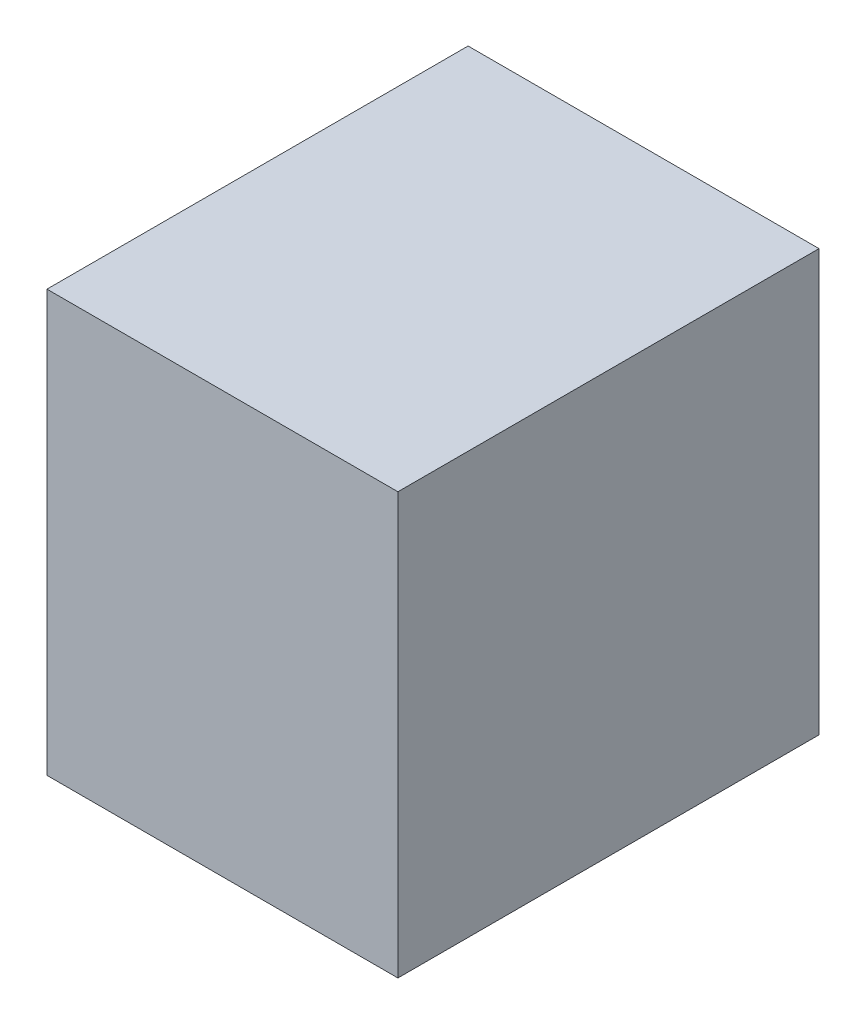
ISO-10303-21;
HEADER;
FILE_DESCRIPTION(('STEP AP214'),'2;1');
FILE_NAME('part.step','',(''),(''),'','','');
FILE_SCHEMA(('AUTOMOTIVE_DESIGN { 1 0 10303 214 1 1 1 1 }'));
ENDSEC;
DATA;
#1=APPLICATION_CONTEXT('core data for automotive mechanical design processes');
#2=APPLICATION_PROTOCOL_DEFINITION('international standard','automotive_design',2000,#1);
#3=PRODUCT_CONTEXT('',#1,'mechanical');
#4=PRODUCT('Part','Part','',(#3));
#5=PRODUCT_RELATED_PRODUCT_CATEGORY('part','',(#4));
#6=PRODUCT_DEFINITION_FORMATION('','',#4);
#7=PRODUCT_DEFINITION_CONTEXT('part definition',#1,'design');
#8=PRODUCT_DEFINITION('design','',#6,#7);
#9=PRODUCT_DEFINITION_SHAPE('','',#8);
#10=(LENGTH_UNIT() NAMED_UNIT(*) SI_UNIT(.MILLI.,.METRE.));
#11=(NAMED_UNIT(*) PLANE_ANGLE_UNIT() SI_UNIT($,.RADIAN.));
#12=(NAMED_UNIT(*) SI_UNIT($,.STERADIAN.) SOLID_ANGLE_UNIT());
#13=UNCERTAINTY_MEASURE_WITH_UNIT(LENGTH_MEASURE(1.E-05),#10,'distance_accuracy_value','');
#14=(GEOMETRIC_REPRESENTATION_CONTEXT(3) GLOBAL_UNCERTAINTY_ASSIGNED_CONTEXT((#13)) GLOBAL_UNIT_ASSIGNED_CONTEXT((#10,
#11,#12)) REPRESENTATION_CONTEXT('',''));
#15=CARTESIAN_POINT('',(0.,0.,0.));
#16=DIRECTION('',(0.,0.,1.));
#17=DIRECTION('',(1.,0.,0.));
#18=AXIS2_PLACEMENT_3D('',#15,#16,#17);
#19=CARTESIAN_POINT('',(125.,640.,-230.));
#20=DIRECTION('',(-1.,0.,0.));
#21=DIRECTION('',(0.,0.,1.));
#22=AXIS2_PLACEMENT_3D('',#19,#20,#21);
#23=PLANE('',#22);
#24=DIRECTION('',(0.,-1.,0.));
#25=VECTOR('',#24,1.);
#26=CARTESIAN_POINT('',(125.,640.,-170.));
#27=LINE('',#26,#25);
#28=CARTESIAN_POINT('',(125.,700.,-170.));
#29=VERTEX_POINT('',#28);
#30=CARTESIAN_POINT('',(125.,640.,-170.));
#31=VERTEX_POINT('',#30);
#32=EDGE_CURVE('E103',#29,#31,#27,.T.);
#33=ORIENTED_EDGE('',*,*,#32,.F.);
#34=DIRECTION('',(0.,0.,1.));
#35=VECTOR('',#34,1.);
#36=CARTESIAN_POINT('',(125.,700.,-230.));
#37=LINE('',#36,#35);
#38=CARTESIAN_POINT('',(125.,700.,-230.));
#39=VERTEX_POINT('',#38);
#40=EDGE_CURVE('E11',#39,#29,#37,.T.);
#41=ORIENTED_EDGE('',*,*,#40,.F.);
#42=DIRECTION('',(0.,-1.,0.));
#43=VECTOR('',#42,1.);
#44=CARTESIAN_POINT('',(125.,640.,-230.));
#45=LINE('',#44,#43);
#46=CARTESIAN_POINT('',(125.,640.,-230.));
#47=VERTEX_POINT('',#46);
#48=EDGE_CURVE('E97',#39,#47,#45,.T.);
#49=ORIENTED_EDGE('',*,*,#48,.T.);
#50=DIRECTION('',(0.,0.,1.));
#51=VECTOR('',#50,1.);
#52=CARTESIAN_POINT('',(125.,640.,-230.));
#53=LINE('',#52,#51);
#54=EDGE_CURVE('E42',#47,#31,#53,.T.);
#55=ORIENTED_EDGE('',*,*,#54,.T.);
#56=EDGE_LOOP('',(#33,#41,#49,#55));
#57=FACE_BOUND('',#56,.T.);
#58=ADVANCED_FACE('F39',(#57),#23,.T.);
#59=CARTESIAN_POINT('',(125.,700.,-230.));
#60=DIRECTION('',(0.,1.,0.));
#61=DIRECTION('',(0.,0.,1.));
#62=AXIS2_PLACEMENT_3D('',#59,#60,#61);
#63=PLANE('',#62);
#64=DIRECTION('',(-1.,0.,0.));
#65=VECTOR('',#64,1.);
#66=CARTESIAN_POINT('',(125.,700.,-170.));
#67=LINE('',#66,#65);
#68=CARTESIAN_POINT('',(175.,700.,-170.));
#69=VERTEX_POINT('',#68);
#70=EDGE_CURVE('E99',#69,#29,#67,.T.);
#71=ORIENTED_EDGE('',*,*,#70,.F.);
#72=DIRECTION('',(0.,0.,1.));
#73=VECTOR('',#72,1.);
#74=CARTESIAN_POINT('',(175.,700.,-230.));
#75=LINE('',#74,#73);
#76=CARTESIAN_POINT('',(175.,700.,-230.));
#77=VERTEX_POINT('',#76);
#78=EDGE_CURVE('E48',#77,#69,#75,.T.);
#79=ORIENTED_EDGE('',*,*,#78,.F.);
#80=DIRECTION('',(-1.,0.,0.));
#81=VECTOR('',#80,1.);
#82=CARTESIAN_POINT('',(125.,700.,-230.));
#83=LINE('',#82,#81);
#84=EDGE_CURVE('E94',#77,#39,#83,.T.);
#85=ORIENTED_EDGE('',*,*,#84,.T.);
#86=ORIENTED_EDGE('',*,*,#40,.T.);
#87=EDGE_LOOP('',(#71,#79,#85,#86));
#88=FACE_BOUND('',#87,.T.);
#89=ADVANCED_FACE('F113',(#88),#63,.T.);
#90=CARTESIAN_POINT('',(175.,640.,-230.));
#91=DIRECTION('',(1.,0.,0.));
#92=DIRECTION('',(0.,0.,-1.));
#93=AXIS2_PLACEMENT_3D('',#90,#91,#92);
#94=PLANE('',#93);
#95=DIRECTION('',(0.,1.,0.));
#96=VECTOR('',#95,1.);
#97=CARTESIAN_POINT('',(175.,640.,-170.));
#98=LINE('',#97,#96);
#99=CARTESIAN_POINT('',(175.,640.,-170.));
#100=VERTEX_POINT('',#99);
#101=EDGE_CURVE('E89',#100,#69,#98,.T.);
#102=ORIENTED_EDGE('',*,*,#101,.F.);
#103=DIRECTION('',(0.,0.,1.));
#104=VECTOR('',#103,1.);
#105=CARTESIAN_POINT('',(175.,640.,-230.));
#106=LINE('',#105,#104);
#107=CARTESIAN_POINT('',(175.,640.,-230.));
#108=VERTEX_POINT('',#107);
#109=EDGE_CURVE('E84',#108,#100,#106,.T.);
#110=ORIENTED_EDGE('',*,*,#109,.F.);
#111=DIRECTION('',(0.,1.,0.));
#112=VECTOR('',#111,1.);
#113=CARTESIAN_POINT('',(175.,640.,-230.));
#114=LINE('',#113,#112);
#115=EDGE_CURVE('E87',#108,#77,#114,.T.);
#116=ORIENTED_EDGE('',*,*,#115,.T.);
#117=ORIENTED_EDGE('',*,*,#78,.T.);
#118=EDGE_LOOP('',(#102,#110,#116,#117));
#119=FACE_BOUND('',#118,.T.);
#120=ADVANCED_FACE('F86',(#119),#94,.T.);
#121=CARTESIAN_POINT('',(125.,640.,-230.));
#122=DIRECTION('',(0.,-1.,0.));
#123=DIRECTION('',(0.,0.,-1.));
#124=AXIS2_PLACEMENT_3D('',#121,#122,#123);
#125=PLANE('',#124);
#126=DIRECTION('',(1.,0.,0.));
#127=VECTOR('',#126,1.);
#128=CARTESIAN_POINT('',(125.,640.,-170.));
#129=LINE('',#128,#127);
#130=EDGE_CURVE('E106',#31,#100,#129,.T.);
#131=ORIENTED_EDGE('',*,*,#130,.F.);
#132=ORIENTED_EDGE('',*,*,#54,.F.);
#133=DIRECTION('',(1.,0.,0.));
#134=VECTOR('',#133,1.);
#135=CARTESIAN_POINT('',(125.,640.,-230.));
#136=LINE('',#135,#134);
#137=EDGE_CURVE('E93',#47,#108,#136,.T.);
#138=ORIENTED_EDGE('',*,*,#137,.T.);
#139=ORIENTED_EDGE('',*,*,#109,.T.);
#140=EDGE_LOOP('',(#131,#132,#138,#139));
#141=FACE_BOUND('',#140,.T.);
#142=ADVANCED_FACE('F96',(#141),#125,.T.);
#143=CARTESIAN_POINT('',(0.,0.,-230.));
#144=DIRECTION('',(0.,0.,-1.));
#145=DIRECTION('',(-1.,0.,0.));
#146=AXIS2_PLACEMENT_3D('',#143,#144,#145);
#147=PLANE('',#146);
#148=ORIENTED_EDGE('',*,*,#48,.F.);
#149=ORIENTED_EDGE('',*,*,#84,.F.);
#150=ORIENTED_EDGE('',*,*,#115,.F.);
#151=ORIENTED_EDGE('',*,*,#137,.F.);
#152=EDGE_LOOP('',(#148,#149,#150,#151));
#153=FACE_BOUND('',#152,.T.);
#154=ADVANCED_FACE('F92',(#153),#147,.T.);
#155=CARTESIAN_POINT('',(0.,0.,-170.));
#156=DIRECTION('',(0.,0.,-1.));
#157=DIRECTION('',(-1.,0.,0.));
#158=AXIS2_PLACEMENT_3D('',#155,#156,#157);
#159=PLANE('',#158);
#160=ORIENTED_EDGE('',*,*,#32,.T.);
#161=ORIENTED_EDGE('',*,*,#130,.T.);
#162=ORIENTED_EDGE('',*,*,#101,.T.);
#163=ORIENTED_EDGE('',*,*,#70,.T.);
#164=EDGE_LOOP('',(#160,#161,#162,#163));
#165=FACE_BOUND('',#164,.T.);
#166=ADVANCED_FACE('F112',(#165),#159,.F.);
#167=CLOSED_SHELL('',(#58,#89,#120,#142,#154,#166));
#168=MANIFOLD_SOLID_BREP('B2',#167);
#169=ADVANCED_BREP_SHAPE_REPRESENTATION('',(#18,#168),#14);
#170=SHAPE_DEFINITION_REPRESENTATION(#9,#169);
ENDSEC;
END-ISO-10303-21;
